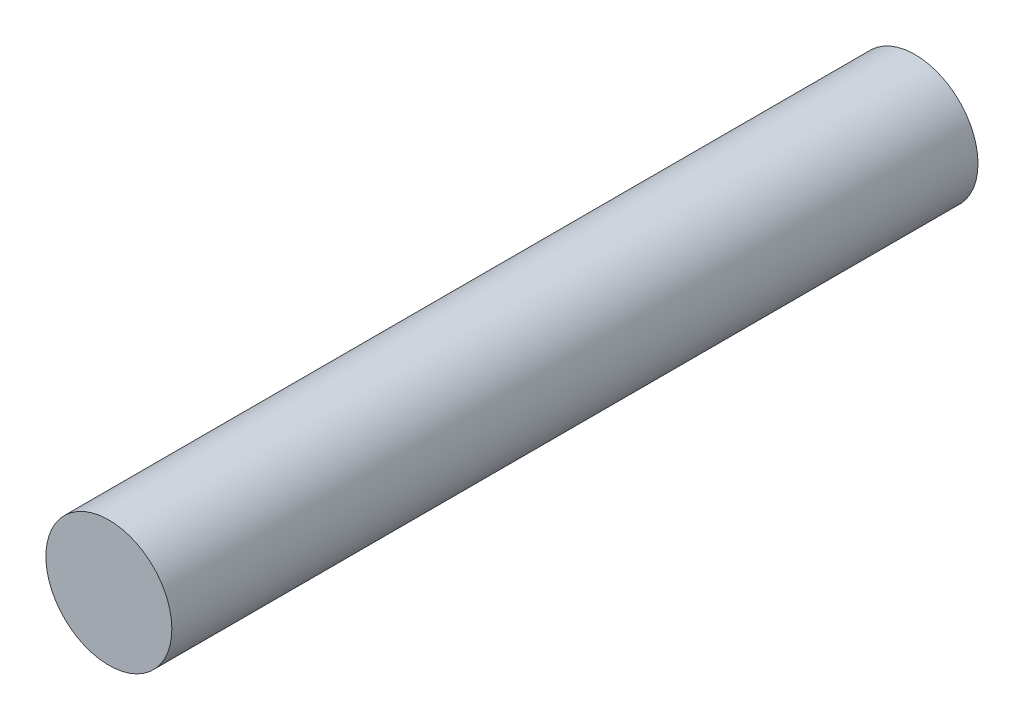
ISO-10303-21;
HEADER;
FILE_DESCRIPTION(('STEP AP214'),'2;1');
FILE_NAME('part.step','',(''),(''),'','','');
FILE_SCHEMA(('AUTOMOTIVE_DESIGN { 1 0 10303 214 1 1 1 1 }'));
ENDSEC;
DATA;
#1=APPLICATION_CONTEXT('core data for automotive mechanical design processes');
#2=APPLICATION_PROTOCOL_DEFINITION('international standard','automotive_design',2000,#1);
#3=PRODUCT_CONTEXT('',#1,'mechanical');
#4=PRODUCT('Part','Part','',(#3));
#5=PRODUCT_RELATED_PRODUCT_CATEGORY('part','',(#4));
#6=PRODUCT_DEFINITION_FORMATION('','',#4);
#7=PRODUCT_DEFINITION_CONTEXT('part definition',#1,'design');
#8=PRODUCT_DEFINITION('design','',#6,#7);
#9=PRODUCT_DEFINITION_SHAPE('','',#8);
#10=(LENGTH_UNIT() NAMED_UNIT(*) SI_UNIT(.MILLI.,.METRE.));
#11=(NAMED_UNIT(*) PLANE_ANGLE_UNIT() SI_UNIT($,.RADIAN.));
#12=(NAMED_UNIT(*) SI_UNIT($,.STERADIAN.) SOLID_ANGLE_UNIT());
#13=UNCERTAINTY_MEASURE_WITH_UNIT(LENGTH_MEASURE(1.E-05),#10,'distance_accuracy_value','');
#14=(GEOMETRIC_REPRESENTATION_CONTEXT(3) GLOBAL_UNCERTAINTY_ASSIGNED_CONTEXT((#13)) GLOBAL_UNIT_ASSIGNED_CONTEXT((#10,
#11,#12)) REPRESENTATION_CONTEXT('',''));
#15=CARTESIAN_POINT('',(0.,0.,0.));
#16=DIRECTION('',(0.,0.,1.));
#17=DIRECTION('',(1.,0.,0.));
#18=AXIS2_PLACEMENT_3D('',#15,#16,#17);
#19=CARTESIAN_POINT('',(0.,0.,16.));
#20=DIRECTION('',(0.,0.,-1.));
#21=DIRECTION('',(-1.,0.,0.));
#22=AXIS2_PLACEMENT_3D('',#19,#20,#21);
#23=CYLINDRICAL_SURFACE('',#22,2.5);
#24=CARTESIAN_POINT('',(0.,0.,16.));
#25=DIRECTION('',(0.,0.,1.));
#26=DIRECTION('',(1.,0.,0.));
#27=AXIS2_PLACEMENT_3D('',#24,#25,#26);
#28=CIRCLE('',#27,2.5);
#29=CARTESIAN_POINT('',(2.5,0.,16.));
#30=VERTEX_POINT('',#29);
#31=EDGE_CURVE('E10',#30,#30,#28,.T.);
#32=ORIENTED_EDGE('',*,*,#31,.F.);
#33=EDGE_LOOP('',(#32));
#34=FACE_BOUND('',#33,.T.);
#35=CARTESIAN_POINT('',(0.,0.,-16.));
#36=DIRECTION('',(0.,0.,1.));
#37=DIRECTION('',(1.,0.,0.));
#38=AXIS2_PLACEMENT_3D('',#35,#36,#37);
#39=CIRCLE('',#38,2.5);
#40=CARTESIAN_POINT('',(2.5,0.,-16.));
#41=VERTEX_POINT('',#40);
#42=EDGE_CURVE('E33',#41,#41,#39,.T.);
#43=ORIENTED_EDGE('',*,*,#42,.T.);
#44=EDGE_LOOP('',(#43));
#45=FACE_BOUND('',#44,.T.);
#46=ADVANCED_FACE('F30',(#34,#45),#23,.T.);
#47=CARTESIAN_POINT('',(0.,0.,16.));
#48=DIRECTION('',(0.,0.,1.));
#49=DIRECTION('',(1.,0.,0.));
#50=AXIS2_PLACEMENT_3D('',#47,#48,#49);
#51=PLANE('',#50);
#52=ORIENTED_EDGE('',*,*,#31,.T.);
#53=EDGE_LOOP('',(#52));
#54=FACE_BOUND('',#53,.T.);
#55=ADVANCED_FACE('F45',(#54),#51,.T.);
#56=CARTESIAN_POINT('',(0.,0.,-16.));
#57=DIRECTION('',(0.,0.,1.));
#58=DIRECTION('',(1.,0.,0.));
#59=AXIS2_PLACEMENT_3D('',#56,#57,#58);
#60=PLANE('',#59);
#61=ORIENTED_EDGE('',*,*,#42,.F.);
#62=EDGE_LOOP('',(#61));
#63=FACE_BOUND('',#62,.T.);
#64=ADVANCED_FACE('F43',(#63),#60,.F.);
#65=CLOSED_SHELL('',(#46,#55,#64));
#66=MANIFOLD_SOLID_BREP('B2',#65);
#67=ADVANCED_BREP_SHAPE_REPRESENTATION('',(#18,#66),#14);
#68=SHAPE_DEFINITION_REPRESENTATION(#9,#67);
ENDSEC;
END-ISO-10303-21;
